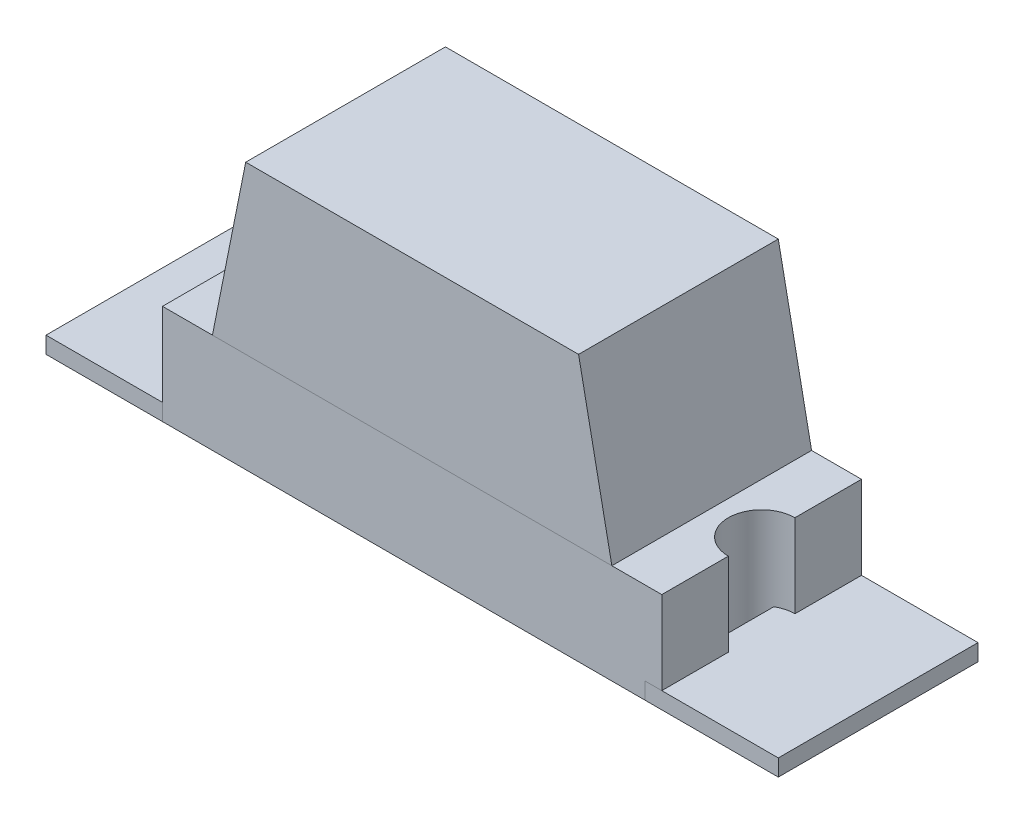
ISO-10303-21;
HEADER;
FILE_DESCRIPTION(('STEP AP214'),'2;1');
FILE_NAME('part.step','',(''),(''),'','','');
FILE_SCHEMA(('AUTOMOTIVE_DESIGN { 1 0 10303 214 1 1 1 1 }'));
ENDSEC;
DATA;
#1=APPLICATION_CONTEXT('core data for automotive mechanical design processes');
#2=APPLICATION_PROTOCOL_DEFINITION('international standard','automotive_design',2000,#1);
#3=PRODUCT_CONTEXT('',#1,'mechanical');
#4=PRODUCT('Part','Part','',(#3));
#5=PRODUCT_RELATED_PRODUCT_CATEGORY('part','',(#4));
#6=PRODUCT_DEFINITION_FORMATION('','',#4);
#7=PRODUCT_DEFINITION_CONTEXT('part definition',#1,'design');
#8=PRODUCT_DEFINITION('design','',#6,#7);
#9=PRODUCT_DEFINITION_SHAPE('','',#8);
#10=(LENGTH_UNIT() NAMED_UNIT(*) SI_UNIT(.MILLI.,.METRE.));
#11=(NAMED_UNIT(*) PLANE_ANGLE_UNIT() SI_UNIT($,.RADIAN.));
#12=(NAMED_UNIT(*) SI_UNIT($,.STERADIAN.) SOLID_ANGLE_UNIT());
#13=UNCERTAINTY_MEASURE_WITH_UNIT(LENGTH_MEASURE(1.E-05),#10,'distance_accuracy_value','');
#14=(GEOMETRIC_REPRESENTATION_CONTEXT(3) GLOBAL_UNCERTAINTY_ASSIGNED_CONTEXT((#13)) GLOBAL_UNIT_ASSIGNED_CONTEXT((#10,
#11,#12)) REPRESENTATION_CONTEXT('',''));
#15=CARTESIAN_POINT('',(0.,0.,0.));
#16=DIRECTION('',(0.,0.,1.));
#17=DIRECTION('',(1.,0.,0.));
#18=AXIS2_PLACEMENT_3D('',#15,#16,#17);
#19=CARTESIAN_POINT('',(-0.5,0.8,0.3));
#20=DIRECTION('',(0.98058067569092,-0.196116135138184,0.));
#21=DIRECTION('',(0.196116135138184,0.98058067569092,0.));
#22=AXIS2_PLACEMENT_3D('',#19,#20,#21);
#23=PLANE('',#22);
#24=DIRECTION('',(-0.196116135138184,-0.98058067569092,0.));
#25=VECTOR('',#24,1.);
#26=CARTESIAN_POINT('',(-0.5,0.8,-0.3));
#27=LINE('',#26,#25);
#28=CARTESIAN_POINT('',(-0.5,0.8,-0.3));
#29=VERTEX_POINT('',#28);
#30=CARTESIAN_POINT('',(-0.6,0.3,-0.3));
#31=VERTEX_POINT('',#30);
#32=EDGE_CURVE('E120',#29,#31,#27,.T.);
#33=ORIENTED_EDGE('',*,*,#32,.T.);
#34=DIRECTION('',(0.,0.,-1.));
#35=VECTOR('',#34,1.);
#36=CARTESIAN_POINT('',(-0.6,0.3,0.3));
#37=LINE('',#36,#35);
#38=CARTESIAN_POINT('',(-0.6,0.3,0.3));
#39=VERTEX_POINT('',#38);
#40=EDGE_CURVE('E12',#39,#31,#37,.T.);
#41=ORIENTED_EDGE('',*,*,#40,.F.);
#42=DIRECTION('',(-0.196116135138184,-0.98058067569092,0.));
#43=VECTOR('',#42,1.);
#44=CARTESIAN_POINT('',(-0.5,0.8,0.3));
#45=LINE('',#44,#43);
#46=CARTESIAN_POINT('',(-0.5,0.8,0.3));
#47=VERTEX_POINT('',#46);
#48=EDGE_CURVE('E104',#47,#39,#45,.T.);
#49=ORIENTED_EDGE('',*,*,#48,.F.);
#50=DIRECTION('',(0.,0.,-1.));
#51=VECTOR('',#50,1.);
#52=CARTESIAN_POINT('',(-0.5,0.8,0.3));
#53=LINE('',#52,#51);
#54=EDGE_CURVE('E116',#47,#29,#53,.T.);
#55=ORIENTED_EDGE('',*,*,#54,.T.);
#56=EDGE_LOOP('',(#33,#41,#49,#55));
#57=FACE_BOUND('',#56,.T.);
#58=ADVANCED_FACE('F52',(#57),#23,.F.);
#59=CARTESIAN_POINT('',(-0.6,0.3,0.3));
#60=DIRECTION('',(0.,1.,0.));
#61=DIRECTION('',(-1.,0.,0.));
#62=AXIS2_PLACEMENT_3D('',#59,#60,#61);
#63=PLANE('',#62);
#64=DIRECTION('',(1.,0.,0.));
#65=VECTOR('',#64,1.);
#66=CARTESIAN_POINT('',(-0.6,0.3,-0.3));
#67=LINE('',#66,#65);
#68=CARTESIAN_POINT('',(0.6,0.3,-0.3));
#69=VERTEX_POINT('',#68);
#70=EDGE_CURVE('E109',#31,#69,#67,.T.);
#71=ORIENTED_EDGE('',*,*,#70,.T.);
#72=DIRECTION('',(0.,0.,-1.));
#73=VECTOR('',#72,1.);
#74=CARTESIAN_POINT('',(0.6,0.3,0.3));
#75=LINE('',#74,#73);
#76=CARTESIAN_POINT('',(0.6,0.3,0.3));
#77=VERTEX_POINT('',#76);
#78=EDGE_CURVE('E61',#77,#69,#75,.T.);
#79=ORIENTED_EDGE('',*,*,#78,.F.);
#80=DIRECTION('',(1.,0.,0.));
#81=VECTOR('',#80,1.);
#82=CARTESIAN_POINT('',(-0.6,0.3,0.3));
#83=LINE('',#82,#81);
#84=EDGE_CURVE('E99',#39,#77,#83,.T.);
#85=ORIENTED_EDGE('',*,*,#84,.F.);
#86=ORIENTED_EDGE('',*,*,#40,.T.);
#87=EDGE_LOOP('',(#71,#79,#85,#86));
#88=FACE_BOUND('',#87,.T.);
#89=ADVANCED_FACE('F108',(#88),#63,.F.);
#90=CARTESIAN_POINT('',(0.6,0.3,0.3));
#91=DIRECTION('',(-0.98058067569092,-0.196116135138184,0.));
#92=DIRECTION('',(0.196116135138184,-0.98058067569092,0.));
#93=AXIS2_PLACEMENT_3D('',#90,#91,#92);
#94=PLANE('',#93);
#95=DIRECTION('',(-0.196116135138184,0.98058067569092,0.));
#96=VECTOR('',#95,1.);
#97=CARTESIAN_POINT('',(0.6,0.3,-0.3));
#98=LINE('',#97,#96);
#99=CARTESIAN_POINT('',(0.5,0.8,-0.3));
#100=VERTEX_POINT('',#99);
#101=EDGE_CURVE('E86',#69,#100,#98,.T.);
#102=ORIENTED_EDGE('',*,*,#101,.T.);
#103=DIRECTION('',(0.,0.,-1.));
#104=VECTOR('',#103,1.);
#105=CARTESIAN_POINT('',(0.5,0.8,0.3));
#106=LINE('',#105,#104);
#107=CARTESIAN_POINT('',(0.5,0.8,0.3));
#108=VERTEX_POINT('',#107);
#109=EDGE_CURVE('E111',#108,#100,#106,.T.);
#110=ORIENTED_EDGE('',*,*,#109,.F.);
#111=DIRECTION('',(-0.196116135138184,0.98058067569092,0.));
#112=VECTOR('',#111,1.);
#113=CARTESIAN_POINT('',(0.6,0.3,0.3));
#114=LINE('',#113,#112);
#115=EDGE_CURVE('E102',#77,#108,#114,.T.);
#116=ORIENTED_EDGE('',*,*,#115,.F.);
#117=ORIENTED_EDGE('',*,*,#78,.T.);
#118=EDGE_LOOP('',(#102,#110,#116,#117));
#119=FACE_BOUND('',#118,.T.);
#120=ADVANCED_FACE('F112',(#119),#94,.F.);
#121=CARTESIAN_POINT('',(0.5,0.8,0.3));
#122=DIRECTION('',(0.,-1.,0.));
#123=DIRECTION('',(1.,0.,0.));
#124=AXIS2_PLACEMENT_3D('',#121,#122,#123);
#125=PLANE('',#124);
#126=DIRECTION('',(-1.,0.,0.));
#127=VECTOR('',#126,1.);
#128=CARTESIAN_POINT('',(0.5,0.8,-0.3));
#129=LINE('',#128,#127);
#130=EDGE_CURVE('E92',#100,#29,#129,.T.);
#131=ORIENTED_EDGE('',*,*,#130,.T.);
#132=ORIENTED_EDGE('',*,*,#54,.F.);
#133=DIRECTION('',(-1.,0.,0.));
#134=VECTOR('',#133,1.);
#135=CARTESIAN_POINT('',(0.5,0.8,0.3));
#136=LINE('',#135,#134);
#137=EDGE_CURVE('E69',#108,#47,#136,.T.);
#138=ORIENTED_EDGE('',*,*,#137,.F.);
#139=ORIENTED_EDGE('',*,*,#109,.T.);
#140=EDGE_LOOP('',(#131,#132,#138,#139));
#141=FACE_BOUND('',#140,.T.);
#142=ADVANCED_FACE('F133',(#141),#125,.F.);
#143=CARTESIAN_POINT('',(0.,0.,0.3));
#144=DIRECTION('',(0.,0.,1.));
#145=DIRECTION('',(1.,0.,0.));
#146=AXIS2_PLACEMENT_3D('',#143,#144,#145);
#147=PLANE('',#146);
#148=ORIENTED_EDGE('',*,*,#48,.T.);
#149=ORIENTED_EDGE('',*,*,#84,.T.);
#150=ORIENTED_EDGE('',*,*,#115,.T.);
#151=ORIENTED_EDGE('',*,*,#137,.T.);
#152=EDGE_LOOP('',(#148,#149,#150,#151));
#153=FACE_BOUND('',#152,.T.);
#154=ADVANCED_FACE('F100',(#153),#147,.T.);
#155=CARTESIAN_POINT('',(0.,0.,-0.3));
#156=DIRECTION('',(0.,0.,1.));
#157=DIRECTION('',(1.,0.,0.));
#158=AXIS2_PLACEMENT_3D('',#155,#156,#157);
#159=PLANE('',#158);
#160=ORIENTED_EDGE('',*,*,#32,.F.);
#161=ORIENTED_EDGE('',*,*,#130,.F.);
#162=ORIENTED_EDGE('',*,*,#101,.F.);
#163=ORIENTED_EDGE('',*,*,#70,.F.);
#164=EDGE_LOOP('',(#160,#161,#162,#163));
#165=FACE_BOUND('',#164,.T.);
#166=ADVANCED_FACE('F136',(#165),#159,.F.);
#167=CLOSED_SHELL('',(#58,#89,#120,#142,#154,#166));
#168=MANIFOLD_SOLID_BREP('B2',#167);
#169=CARTESIAN_POINT('',(1.1,0.05,-0.3));
#170=DIRECTION('',(0.,0.,1.));
#171=DIRECTION('',(1.,0.,0.));
#172=AXIS2_PLACEMENT_3D('',#169,#170,#171);
#173=PLANE('',#172);
#174=DIRECTION('',(-1.,0.,0.));
#175=VECTOR('',#174,1.);
#176=CARTESIAN_POINT('',(1.1,0.,-0.3));
#177=LINE('',#176,#175);
#178=CARTESIAN_POINT('',(1.1,0.,-0.3));
#179=VERTEX_POINT('',#178);
#180=CARTESIAN_POINT('',(0.7,0.,-0.3));
#181=VERTEX_POINT('',#180);
#182=EDGE_CURVE('E261',#179,#181,#177,.T.);
#183=ORIENTED_EDGE('',*,*,#182,.T.);
#184=DIRECTION('',(0.,-1.,0.));
#185=VECTOR('',#184,1.);
#186=CARTESIAN_POINT('',(0.7,0.05,-0.3));
#187=LINE('',#186,#185);
#188=CARTESIAN_POINT('',(0.7,0.05,-0.3));
#189=VERTEX_POINT('',#188);
#190=EDGE_CURVE('E50',#189,#181,#187,.T.);
#191=ORIENTED_EDGE('',*,*,#190,.F.);
#192=DIRECTION('',(-1.,0.,0.));
#193=VECTOR('',#192,1.);
#194=CARTESIAN_POINT('',(1.1,0.05,-0.3));
#195=LINE('',#194,#193);
#196=CARTESIAN_POINT('',(1.1,0.05,-0.3));
#197=VERTEX_POINT('',#196);
#198=EDGE_CURVE('E249',#197,#189,#195,.T.);
#199=ORIENTED_EDGE('',*,*,#198,.F.);
#200=DIRECTION('',(0.,-1.,0.));
#201=VECTOR('',#200,1.);
#202=CARTESIAN_POINT('',(1.1,0.05,-0.3));
#203=LINE('',#202,#201);
#204=EDGE_CURVE('E257',#197,#179,#203,.T.);
#205=ORIENTED_EDGE('',*,*,#204,.T.);
#206=EDGE_LOOP('',(#183,#191,#199,#205));
#207=FACE_BOUND('',#206,.T.);
#208=ADVANCED_FACE('F198',(#207),#173,.F.);
#209=CARTESIAN_POINT('',(0.7,0.05,-0.3));
#210=DIRECTION('',(1.,0.,0.));
#211=DIRECTION('',(0.,0.,-1.));
#212=AXIS2_PLACEMENT_3D('',#209,#210,#211);
#213=PLANE('',#212);
#214=DIRECTION('',(0.,0.,1.));
#215=VECTOR('',#214,1.);
#216=CARTESIAN_POINT('',(0.7,0.,-0.3));
#217=LINE('',#216,#215);
#218=CARTESIAN_POINT('',(0.7,0.,0.3));
#219=VERTEX_POINT('',#218);
#220=EDGE_CURVE('E253',#181,#219,#217,.T.);
#221=ORIENTED_EDGE('',*,*,#220,.T.);
#222=DIRECTION('',(0.,-1.,0.));
#223=VECTOR('',#222,1.);
#224=CARTESIAN_POINT('',(0.7,0.05,0.3));
#225=LINE('',#224,#223);
#226=CARTESIAN_POINT('',(0.7,0.05,0.3));
#227=VERTEX_POINT('',#226);
#228=EDGE_CURVE('E206',#227,#219,#225,.T.);
#229=ORIENTED_EDGE('',*,*,#228,.F.);
#230=DIRECTION('',(0.,0.,1.));
#231=VECTOR('',#230,1.);
#232=CARTESIAN_POINT('',(0.7,0.05,-0.3));
#233=LINE('',#232,#231);
#234=EDGE_CURVE('E244',#189,#227,#233,.T.);
#235=ORIENTED_EDGE('',*,*,#234,.F.);
#236=ORIENTED_EDGE('',*,*,#190,.T.);
#237=EDGE_LOOP('',(#221,#229,#235,#236));
#238=FACE_BOUND('',#237,.T.);
#239=ADVANCED_FACE('F252',(#238),#213,.F.);
#240=CARTESIAN_POINT('',(1.1,0.05,0.3));
#241=DIRECTION('',(0.,0.,-1.));
#242=DIRECTION('',(-1.,0.,0.));
#243=AXIS2_PLACEMENT_3D('',#240,#241,#242);
#244=PLANE('',#243);
#245=DIRECTION('',(1.,0.,0.));
#246=VECTOR('',#245,1.);
#247=CARTESIAN_POINT('',(1.1,0.,0.3));
#248=LINE('',#247,#246);
#249=CARTESIAN_POINT('',(1.1,0.,0.3));
#250=VERTEX_POINT('',#249);
#251=EDGE_CURVE('E231',#219,#250,#248,.T.);
#252=ORIENTED_EDGE('',*,*,#251,.T.);
#253=DIRECTION('',(0.,-1.,0.));
#254=VECTOR('',#253,1.);
#255=CARTESIAN_POINT('',(1.1,0.05,0.3));
#256=LINE('',#255,#254);
#257=CARTESIAN_POINT('',(1.1,0.05,0.3));
#258=VERTEX_POINT('',#257);
#259=EDGE_CURVE('E254',#258,#250,#256,.T.);
#260=ORIENTED_EDGE('',*,*,#259,.F.);
#261=DIRECTION('',(1.,0.,0.));
#262=VECTOR('',#261,1.);
#263=CARTESIAN_POINT('',(1.1,0.05,0.3));
#264=LINE('',#263,#262);
#265=EDGE_CURVE('E247',#227,#258,#264,.T.);
#266=ORIENTED_EDGE('',*,*,#265,.F.);
#267=ORIENTED_EDGE('',*,*,#228,.T.);
#268=EDGE_LOOP('',(#252,#260,#266,#267));
#269=FACE_BOUND('',#268,.T.);
#270=ADVANCED_FACE('F255',(#269),#244,.F.);
#271=CARTESIAN_POINT('',(1.1,0.05,-0.3));
#272=DIRECTION('',(-1.,0.,0.));
#273=DIRECTION('',(0.,0.,1.));
#274=AXIS2_PLACEMENT_3D('',#271,#272,#273);
#275=PLANE('',#274);
#276=DIRECTION('',(0.,0.,-1.));
#277=VECTOR('',#276,1.);
#278=CARTESIAN_POINT('',(1.1,0.,-0.3));
#279=LINE('',#278,#277);
#280=EDGE_CURVE('E237',#250,#179,#279,.T.);
#281=ORIENTED_EDGE('',*,*,#280,.T.);
#282=ORIENTED_EDGE('',*,*,#204,.F.);
#283=DIRECTION('',(0.,0.,-1.));
#284=VECTOR('',#283,1.);
#285=CARTESIAN_POINT('',(1.1,0.05,-0.3));
#286=LINE('',#285,#284);
#287=EDGE_CURVE('E214',#258,#197,#286,.T.);
#288=ORIENTED_EDGE('',*,*,#287,.F.);
#289=ORIENTED_EDGE('',*,*,#259,.T.);
#290=EDGE_LOOP('',(#281,#282,#288,#289));
#291=FACE_BOUND('',#290,.T.);
#292=ADVANCED_FACE('F268',(#291),#275,.F.);
#293=CARTESIAN_POINT('',(0.,0.05,0.));
#294=DIRECTION('',(0.,1.,0.));
#295=DIRECTION('',(0.,0.,1.));
#296=AXIS2_PLACEMENT_3D('',#293,#294,#295);
#297=PLANE('',#296);
#298=ORIENTED_EDGE('',*,*,#198,.T.);
#299=ORIENTED_EDGE('',*,*,#234,.T.);
#300=ORIENTED_EDGE('',*,*,#265,.T.);
#301=ORIENTED_EDGE('',*,*,#287,.T.);
#302=EDGE_LOOP('',(#298,#299,#300,#301));
#303=FACE_BOUND('',#302,.T.);
#304=ADVANCED_FACE('F245',(#303),#297,.T.);
#305=CARTESIAN_POINT('',(0.,0.,0.));
#306=DIRECTION('',(0.,1.,0.));
#307=DIRECTION('',(0.,0.,1.));
#308=AXIS2_PLACEMENT_3D('',#305,#306,#307);
#309=PLANE('',#308);
#310=ORIENTED_EDGE('',*,*,#182,.F.);
#311=ORIENTED_EDGE('',*,*,#280,.F.);
#312=ORIENTED_EDGE('',*,*,#251,.F.);
#313=ORIENTED_EDGE('',*,*,#220,.F.);
#314=EDGE_LOOP('',(#310,#311,#312,#313));
#315=FACE_BOUND('',#314,.T.);
#316=ADVANCED_FACE('F271',(#315),#309,.F.);
#317=CLOSED_SHELL('',(#208,#239,#270,#292,#304,#316));
#318=MANIFOLD_SOLID_BREP('B6',#317);
#319=CARTESIAN_POINT('',(-1.1,0.05,-0.3));
#320=DIRECTION('',(1.,0.,0.));
#321=DIRECTION('',(0.,0.,-1.));
#322=AXIS2_PLACEMENT_3D('',#319,#320,#321);
#323=PLANE('',#322);
#324=DIRECTION('',(0.,0.,1.));
#325=VECTOR('',#324,1.);
#326=CARTESIAN_POINT('',(-1.1,0.,-0.3));
#327=LINE('',#326,#325);
#328=CARTESIAN_POINT('',(-1.1,0.,-0.3));
#329=VERTEX_POINT('',#328);
#330=CARTESIAN_POINT('',(-1.1,0.,0.3));
#331=VERTEX_POINT('',#330);
#332=EDGE_CURVE('E393',#329,#331,#327,.T.);
#333=ORIENTED_EDGE('',*,*,#332,.T.);
#334=DIRECTION('',(0.,-1.,0.));
#335=VECTOR('',#334,1.);
#336=CARTESIAN_POINT('',(-1.1,0.05,0.3));
#337=LINE('',#336,#335);
#338=CARTESIAN_POINT('',(-1.1,0.05,0.3));
#339=VERTEX_POINT('',#338);
#340=EDGE_CURVE('E196',#339,#331,#337,.T.);
#341=ORIENTED_EDGE('',*,*,#340,.F.);
#342=DIRECTION('',(0.,0.,1.));
#343=VECTOR('',#342,1.);
#344=CARTESIAN_POINT('',(-1.1,0.05,-0.3));
#345=LINE('',#344,#343);
#346=CARTESIAN_POINT('',(-1.1,0.05,-0.3));
#347=VERTEX_POINT('',#346);
#348=EDGE_CURVE('E381',#347,#339,#345,.T.);
#349=ORIENTED_EDGE('',*,*,#348,.F.);
#350=DIRECTION('',(0.,-1.,0.));
#351=VECTOR('',#350,1.);
#352=CARTESIAN_POINT('',(-1.1,0.05,-0.3));
#353=LINE('',#352,#351);
#354=EDGE_CURVE('E389',#347,#329,#353,.T.);
#355=ORIENTED_EDGE('',*,*,#354,.T.);
#356=EDGE_LOOP('',(#333,#341,#349,#355));
#357=FACE_BOUND('',#356,.T.);
#358=ADVANCED_FACE('F330',(#357),#323,.F.);
#359=CARTESIAN_POINT('',(-1.1,0.05,0.3));
#360=DIRECTION('',(0.,0.,-1.));
#361=DIRECTION('',(-1.,0.,0.));
#362=AXIS2_PLACEMENT_3D('',#359,#360,#361);
#363=PLANE('',#362);
#364=DIRECTION('',(1.,0.,0.));
#365=VECTOR('',#364,1.);
#366=CARTESIAN_POINT('',(-1.1,0.,0.3));
#367=LINE('',#366,#365);
#368=CARTESIAN_POINT('',(-0.7,0.,0.3));
#369=VERTEX_POINT('',#368);
#370=EDGE_CURVE('E385',#331,#369,#367,.T.);
#371=ORIENTED_EDGE('',*,*,#370,.T.);
#372=DIRECTION('',(0.,-1.,0.));
#373=VECTOR('',#372,1.);
#374=CARTESIAN_POINT('',(-0.7,0.05,0.3));
#375=LINE('',#374,#373);
#376=CARTESIAN_POINT('',(-0.7,0.05,0.3));
#377=VERTEX_POINT('',#376);
#378=EDGE_CURVE('E338',#377,#369,#375,.T.);
#379=ORIENTED_EDGE('',*,*,#378,.F.);
#380=DIRECTION('',(1.,0.,0.));
#381=VECTOR('',#380,1.);
#382=CARTESIAN_POINT('',(-1.1,0.05,0.3));
#383=LINE('',#382,#381);
#384=EDGE_CURVE('E376',#339,#377,#383,.T.);
#385=ORIENTED_EDGE('',*,*,#384,.F.);
#386=ORIENTED_EDGE('',*,*,#340,.T.);
#387=EDGE_LOOP('',(#371,#379,#385,#386));
#388=FACE_BOUND('',#387,.T.);
#389=ADVANCED_FACE('F384',(#388),#363,.F.);
#390=CARTESIAN_POINT('',(-0.7,0.05,-0.3));
#391=DIRECTION('',(-1.,0.,0.));
#392=DIRECTION('',(0.,0.,1.));
#393=AXIS2_PLACEMENT_3D('',#390,#391,#392);
#394=PLANE('',#393);
#395=DIRECTION('',(0.,0.,-1.));
#396=VECTOR('',#395,1.);
#397=CARTESIAN_POINT('',(-0.7,0.,-0.3));
#398=LINE('',#397,#396);
#399=CARTESIAN_POINT('',(-0.7,0.,-0.3));
#400=VERTEX_POINT('',#399);
#401=EDGE_CURVE('E363',#369,#400,#398,.T.);
#402=ORIENTED_EDGE('',*,*,#401,.T.);
#403=DIRECTION('',(0.,-1.,0.));
#404=VECTOR('',#403,1.);
#405=CARTESIAN_POINT('',(-0.7,0.05,-0.3));
#406=LINE('',#405,#404);
#407=CARTESIAN_POINT('',(-0.7,0.05,-0.3));
#408=VERTEX_POINT('',#407);
#409=EDGE_CURVE('E386',#408,#400,#406,.T.);
#410=ORIENTED_EDGE('',*,*,#409,.F.);
#411=DIRECTION('',(0.,0.,-1.));
#412=VECTOR('',#411,1.);
#413=CARTESIAN_POINT('',(-0.7,0.05,-0.3));
#414=LINE('',#413,#412);
#415=EDGE_CURVE('E379',#377,#408,#414,.T.);
#416=ORIENTED_EDGE('',*,*,#415,.F.);
#417=ORIENTED_EDGE('',*,*,#378,.T.);
#418=EDGE_LOOP('',(#402,#410,#416,#417));
#419=FACE_BOUND('',#418,.T.);
#420=ADVANCED_FACE('F387',(#419),#394,.F.);
#421=CARTESIAN_POINT('',(-1.1,0.05,-0.3));
#422=DIRECTION('',(0.,0.,1.));
#423=DIRECTION('',(1.,0.,0.));
#424=AXIS2_PLACEMENT_3D('',#421,#422,#423);
#425=PLANE('',#424);
#426=DIRECTION('',(-1.,0.,0.));
#427=VECTOR('',#426,1.);
#428=CARTESIAN_POINT('',(-1.1,0.,-0.3));
#429=LINE('',#428,#427);
#430=EDGE_CURVE('E369',#400,#329,#429,.T.);
#431=ORIENTED_EDGE('',*,*,#430,.T.);
#432=ORIENTED_EDGE('',*,*,#354,.F.);
#433=DIRECTION('',(-1.,0.,0.));
#434=VECTOR('',#433,1.);
#435=CARTESIAN_POINT('',(-1.1,0.05,-0.3));
#436=LINE('',#435,#434);
#437=EDGE_CURVE('E346',#408,#347,#436,.T.);
#438=ORIENTED_EDGE('',*,*,#437,.F.);
#439=ORIENTED_EDGE('',*,*,#409,.T.);
#440=EDGE_LOOP('',(#431,#432,#438,#439));
#441=FACE_BOUND('',#440,.T.);
#442=ADVANCED_FACE('F400',(#441),#425,.F.);
#443=CARTESIAN_POINT('',(0.,0.05,0.));
#444=DIRECTION('',(0.,1.,0.));
#445=DIRECTION('',(0.,0.,1.));
#446=AXIS2_PLACEMENT_3D('',#443,#444,#445);
#447=PLANE('',#446);
#448=ORIENTED_EDGE('',*,*,#348,.T.);
#449=ORIENTED_EDGE('',*,*,#384,.T.);
#450=ORIENTED_EDGE('',*,*,#415,.T.);
#451=ORIENTED_EDGE('',*,*,#437,.T.);
#452=EDGE_LOOP('',(#448,#449,#450,#451));
#453=FACE_BOUND('',#452,.T.);
#454=ADVANCED_FACE('F377',(#453),#447,.T.);
#455=CARTESIAN_POINT('',(0.,0.,0.));
#456=DIRECTION('',(0.,1.,0.));
#457=DIRECTION('',(0.,0.,1.));
#458=AXIS2_PLACEMENT_3D('',#455,#456,#457);
#459=PLANE('',#458);
#460=ORIENTED_EDGE('',*,*,#332,.F.);
#461=ORIENTED_EDGE('',*,*,#430,.F.);
#462=ORIENTED_EDGE('',*,*,#401,.F.);
#463=ORIENTED_EDGE('',*,*,#370,.F.);
#464=EDGE_LOOP('',(#460,#461,#462,#463));
#465=FACE_BOUND('',#464,.T.);
#466=ADVANCED_FACE('F403',(#465),#459,.F.);
#467=CLOSED_SHELL('',(#358,#389,#420,#442,#454,#466));
#468=MANIFOLD_SOLID_BREP('B44',#467);
#469=CARTESIAN_POINT('',(0.,0.3,0.));
#470=DIRECTION('',(0.,1.,0.));
#471=DIRECTION('',(0.,0.,1.));
#472=AXIS2_PLACEMENT_3D('',#469,#470,#471);
#473=PLANE('',#472);
#474=CARTESIAN_POINT('',(0.,0.3,0.));
#475=DIRECTION('',(0.,1.,0.));
#476=DIRECTION('',(0.,0.,1.));
#477=AXIS2_PLACEMENT_3D('',#474,#475,#476);
#478=CIRCLE('',#477,0.25);
#479=CARTESIAN_POINT('',(0.,0.3,0.25));
#480=VERTEX_POINT('',#479);
#481=EDGE_CURVE('E329',#480,#480,#478,.T.);
#482=ORIENTED_EDGE('',*,*,#481,.F.);
#483=EDGE_LOOP('',(#482));
#484=FACE_BOUND('',#483,.T.);
#485=ADVANCED_FACE('F463',(#484),#473,.F.);
#486=CARTESIAN_POINT('',(0.,0.809216281577376,0.));
#487=DIRECTION('',(0.,1.,0.));
#488=DIRECTION('',(0.,0.,1.));
#489=AXIS2_PLACEMENT_3D('',#486,#487,#488);
#490=CYLINDRICAL_SURFACE('',#489,0.25);
#491=CARTESIAN_POINT('',(0.,0.5,0.));
#492=DIRECTION('',(0.,1.,0.));
#493=DIRECTION('',(0.,0.,1.));
#494=AXIS2_PLACEMENT_3D('',#491,#492,#493);
#495=CIRCLE('',#494,0.25);
#496=CARTESIAN_POINT('',(0.,0.5,0.25));
#497=VERTEX_POINT('',#496);
#498=EDGE_CURVE('E469',#497,#497,#495,.T.);
#499=ORIENTED_EDGE('',*,*,#498,.F.);
#500=EDGE_LOOP('',(#499));
#501=FACE_BOUND('',#500,.T.);
#502=ORIENTED_EDGE('',*,*,#481,.T.);
#503=EDGE_LOOP('',(#502));
#504=FACE_BOUND('',#503,.T.);
#505=ADVANCED_FACE('F477',(#501,#504),#490,.T.);
#506=CARTESIAN_POINT('',(0.,0.5,0.));
#507=DIRECTION('',(0.,-1.,0.));
#508=DIRECTION('',(0.,0.,-1.));
#509=AXIS2_PLACEMENT_3D('',#506,#507,#508);
#510=PLANE('',#509);
#511=ORIENTED_EDGE('',*,*,#498,.T.);
#512=EDGE_LOOP('',(#511));
#513=FACE_BOUND('',#512,.T.);
#514=ADVANCED_FACE('F475',(#513),#510,.F.);
#515=CLOSED_SHELL('',(#485,#505,#514));
#516=MANIFOLD_SOLID_BREP('B190',#515);
#517=CARTESIAN_POINT('',(-0.75,0.3,-0.3));
#518=DIRECTION('',(1.,0.,0.));
#519=DIRECTION('',(0.,0.,-1.));
#520=AXIS2_PLACEMENT_3D('',#517,#518,#519);
#521=PLANE('',#520);
#522=DIRECTION('',(0.,0.,1.));
#523=VECTOR('',#522,1.);
#524=CARTESIAN_POINT('',(-0.75,0.,-0.3));
#525=LINE('',#524,#523);
#526=CARTESIAN_POINT('',(-0.75,0.,-0.3));
#527=VERTEX_POINT('',#526);
#528=CARTESIAN_POINT('',(-0.75,0.,-0.1));
#529=VERTEX_POINT('',#528);
#530=EDGE_CURVE('E600',#527,#529,#525,.T.);
#531=ORIENTED_EDGE('',*,*,#530,.T.);
#532=DIRECTION('',(0.,-1.,0.));
#533=VECTOR('',#532,1.);
#534=CARTESIAN_POINT('',(-0.75,0.3,-0.1));
#535=LINE('',#534,#533);
#536=CARTESIAN_POINT('',(-0.75,0.3,-0.1));
#537=VERTEX_POINT('',#536);
#538=EDGE_CURVE('E461',#537,#529,#535,.T.);
#539=ORIENTED_EDGE('',*,*,#538,.F.);
#540=DIRECTION('',(0.,0.,1.));
#541=VECTOR('',#540,1.);
#542=CARTESIAN_POINT('',(-0.75,0.3,-0.3));
#543=LINE('',#542,#541);
#544=CARTESIAN_POINT('',(-0.75,0.3,-0.3));
#545=VERTEX_POINT('',#544);
#546=EDGE_CURVE('E614',#545,#537,#543,.T.);
#547=ORIENTED_EDGE('',*,*,#546,.F.);
#548=DIRECTION('',(0.,-1.,0.));
#549=VECTOR('',#548,1.);
#550=CARTESIAN_POINT('',(-0.75,0.3,-0.3));
#551=LINE('',#550,#549);
#552=EDGE_CURVE('E596',#545,#527,#551,.T.);
#553=ORIENTED_EDGE('',*,*,#552,.T.);
#554=EDGE_LOOP('',(#531,#539,#547,#553));
#555=FACE_BOUND('',#554,.T.);
#556=ADVANCED_FACE('F504',(#555),#521,.F.);
#557=CARTESIAN_POINT('',(-0.75,0.3,0.));
#558=DIRECTION('',(0.,-1.,0.));
#559=DIRECTION('',(0.,0.,-1.));
#560=AXIS2_PLACEMENT_3D('',#557,#558,#559);
#561=CYLINDRICAL_SURFACE('',#560,0.1);
#562=CARTESIAN_POINT('',(-0.75,0.,0.));
#563=DIRECTION('',(0.,-1.,0.));
#564=DIRECTION('',(0.,0.,1.));
#565=AXIS2_PLACEMENT_3D('',#562,#563,#564);
#566=CIRCLE('',#565,0.1);
#567=CARTESIAN_POINT('',(-0.75,0.,0.1));
#568=VERTEX_POINT('',#567);
#569=EDGE_CURVE('E603',#529,#568,#566,.T.);
#570=ORIENTED_EDGE('',*,*,#569,.T.);
#571=DIRECTION('',(0.,-1.,0.));
#572=VECTOR('',#571,1.);
#573=CARTESIAN_POINT('',(-0.75,0.3,0.1));
#574=LINE('',#573,#572);
#575=CARTESIAN_POINT('',(-0.75,0.3,0.1));
#576=VERTEX_POINT('',#575);
#577=EDGE_CURVE('E512',#576,#568,#574,.T.);
#578=ORIENTED_EDGE('',*,*,#577,.F.);
#579=CARTESIAN_POINT('',(-0.75,0.3,0.));
#580=DIRECTION('',(0.,-1.,0.));
#581=DIRECTION('',(0.,0.,1.));
#582=AXIS2_PLACEMENT_3D('',#579,#580,#581);
#583=CIRCLE('',#582,0.1);
#584=EDGE_CURVE('E563',#537,#576,#583,.T.);
#585=ORIENTED_EDGE('',*,*,#584,.F.);
#586=ORIENTED_EDGE('',*,*,#538,.T.);
#587=EDGE_LOOP('',(#570,#578,#585,#586));
#588=FACE_BOUND('',#587,.T.);
#589=ADVANCED_FACE('F649',(#588),#561,.F.);
#590=CARTESIAN_POINT('',(-0.75,0.3,0.1));
#591=DIRECTION('',(1.,0.,0.));
#592=DIRECTION('',(0.,0.,-1.));
#593=AXIS2_PLACEMENT_3D('',#590,#591,#592);
#594=PLANE('',#593);
#595=DIRECTION('',(0.,0.,1.));
#596=VECTOR('',#595,1.);
#597=CARTESIAN_POINT('',(-0.75,0.,0.1));
#598=LINE('',#597,#596);
#599=CARTESIAN_POINT('',(-0.75,0.,0.3));
#600=VERTEX_POINT('',#599);
#601=EDGE_CURVE('E605',#568,#600,#598,.T.);
#602=ORIENTED_EDGE('',*,*,#601,.T.);
#603=DIRECTION('',(0.,-1.,0.));
#604=VECTOR('',#603,1.);
#605=CARTESIAN_POINT('',(-0.75,0.3,0.3));
#606=LINE('',#605,#604);
#607=CARTESIAN_POINT('',(-0.75,0.3,0.3));
#608=VERTEX_POINT('',#607);
#609=EDGE_CURVE('E621',#608,#600,#606,.T.);
#610=ORIENTED_EDGE('',*,*,#609,.F.);
#611=DIRECTION('',(0.,0.,1.));
#612=VECTOR('',#611,1.);
#613=CARTESIAN_POINT('',(-0.75,0.3,0.1));
#614=LINE('',#613,#612);
#615=EDGE_CURVE('E629',#576,#608,#614,.T.);
#616=ORIENTED_EDGE('',*,*,#615,.F.);
#617=ORIENTED_EDGE('',*,*,#577,.T.);
#618=EDGE_LOOP('',(#602,#610,#616,#617));
#619=FACE_BOUND('',#618,.T.);
#620=ADVANCED_FACE('F627',(#619),#594,.F.);
#621=CARTESIAN_POINT('',(-0.75,0.3,0.3));
#622=DIRECTION('',(0.,0.,-1.));
#623=DIRECTION('',(-1.,0.,0.));
#624=AXIS2_PLACEMENT_3D('',#621,#622,#623);
#625=PLANE('',#624);
#626=DIRECTION('',(1.,0.,0.));
#627=VECTOR('',#626,1.);
#628=CARTESIAN_POINT('',(-0.75,0.,0.3));
#629=LINE('',#628,#627);
#630=CARTESIAN_POINT('',(0.75,0.,0.3));
#631=VERTEX_POINT('',#630);
#632=EDGE_CURVE('E607',#600,#631,#629,.T.);
#633=ORIENTED_EDGE('',*,*,#632,.T.);
#634=DIRECTION('',(0.,-1.,0.));
#635=VECTOR('',#634,1.);
#636=CARTESIAN_POINT('',(0.75,0.3,0.3));
#637=LINE('',#636,#635);
#638=CARTESIAN_POINT('',(0.75,0.3,0.3));
#639=VERTEX_POINT('',#638);
#640=EDGE_CURVE('E618',#639,#631,#637,.T.);
#641=ORIENTED_EDGE('',*,*,#640,.F.);
#642=DIRECTION('',(1.,0.,0.));
#643=VECTOR('',#642,1.);
#644=CARTESIAN_POINT('',(-0.75,0.3,0.3));
#645=LINE('',#644,#643);
#646=EDGE_CURVE('E641',#608,#639,#645,.T.);
#647=ORIENTED_EDGE('',*,*,#646,.F.);
#648=ORIENTED_EDGE('',*,*,#609,.T.);
#649=EDGE_LOOP('',(#633,#641,#647,#648));
#650=FACE_BOUND('',#649,.T.);
#651=ADVANCED_FACE('F637',(#650),#625,.F.);
#652=CARTESIAN_POINT('',(0.75,0.3,0.1));
#653=DIRECTION('',(-1.,0.,0.));
#654=DIRECTION('',(0.,0.,1.));
#655=AXIS2_PLACEMENT_3D('',#652,#653,#654);
#656=PLANE('',#655);
#657=DIRECTION('',(0.,0.,-1.));
#658=VECTOR('',#657,1.);
#659=CARTESIAN_POINT('',(0.75,0.,0.1));
#660=LINE('',#659,#658);
#661=CARTESIAN_POINT('',(0.75,0.,0.1));
#662=VERTEX_POINT('',#661);
#663=EDGE_CURVE('E609',#631,#662,#660,.T.);
#664=ORIENTED_EDGE('',*,*,#663,.T.);
#665=DIRECTION('',(0.,-1.,0.));
#666=VECTOR('',#665,1.);
#667=CARTESIAN_POINT('',(0.75,0.3,0.1));
#668=LINE('',#667,#666);
#669=CARTESIAN_POINT('',(0.75,0.3,0.1));
#670=VERTEX_POINT('',#669);
#671=EDGE_CURVE('E591',#670,#662,#668,.T.);
#672=ORIENTED_EDGE('',*,*,#671,.F.);
#673=DIRECTION('',(0.,0.,-1.));
#674=VECTOR('',#673,1.);
#675=CARTESIAN_POINT('',(0.75,0.3,0.1));
#676=LINE('',#675,#674);
#677=EDGE_CURVE('E582',#639,#670,#676,.T.);
#678=ORIENTED_EDGE('',*,*,#677,.F.);
#679=ORIENTED_EDGE('',*,*,#640,.T.);
#680=EDGE_LOOP('',(#664,#672,#678,#679));
#681=FACE_BOUND('',#680,.T.);
#682=ADVANCED_FACE('F640',(#681),#656,.F.);
#683=CARTESIAN_POINT('',(0.75,0.3,0.));
#684=DIRECTION('',(0.,-1.,0.));
#685=DIRECTION('',(0.,0.,-1.));
#686=AXIS2_PLACEMENT_3D('',#683,#684,#685);
#687=CYLINDRICAL_SURFACE('',#686,0.1);
#688=CARTESIAN_POINT('',(0.75,0.,0.));
#689=DIRECTION('',(0.,-1.,0.));
#690=DIRECTION('',(0.,0.,1.));
#691=AXIS2_PLACEMENT_3D('',#688,#689,#690);
#692=CIRCLE('',#691,0.1);
#693=CARTESIAN_POINT('',(0.75,0.,-0.1));
#694=VERTEX_POINT('',#693);
#695=EDGE_CURVE('E590',#662,#694,#692,.T.);
#696=ORIENTED_EDGE('',*,*,#695,.T.);
#697=DIRECTION('',(0.,-1.,0.));
#698=VECTOR('',#697,1.);
#699=CARTESIAN_POINT('',(0.75,0.3,-0.1));
#700=LINE('',#699,#698);
#701=CARTESIAN_POINT('',(0.75,0.3,-0.1));
#702=VERTEX_POINT('',#701);
#703=EDGE_CURVE('E587',#702,#694,#700,.T.);
#704=ORIENTED_EDGE('',*,*,#703,.F.);
#705=CARTESIAN_POINT('',(0.75,0.3,0.));
#706=DIRECTION('',(0.,-1.,0.));
#707=DIRECTION('',(0.,0.,1.));
#708=AXIS2_PLACEMENT_3D('',#705,#706,#707);
#709=CIRCLE('',#708,0.1);
#710=EDGE_CURVE('E576',#670,#702,#709,.T.);
#711=ORIENTED_EDGE('',*,*,#710,.F.);
#712=ORIENTED_EDGE('',*,*,#671,.T.);
#713=EDGE_LOOP('',(#696,#704,#711,#712));
#714=FACE_BOUND('',#713,.T.);
#715=ADVANCED_FACE('F588',(#714),#687,.F.);
#716=CARTESIAN_POINT('',(0.75,0.3,-0.3));
#717=DIRECTION('',(-1.,0.,0.));
#718=DIRECTION('',(0.,0.,1.));
#719=AXIS2_PLACEMENT_3D('',#716,#717,#718);
#720=PLANE('',#719);
#721=DIRECTION('',(0.,0.,-1.));
#722=VECTOR('',#721,1.);
#723=CARTESIAN_POINT('',(0.75,0.,-0.3));
#724=LINE('',#723,#722);
#725=CARTESIAN_POINT('',(0.75,0.,-0.3));
#726=VERTEX_POINT('',#725);
#727=EDGE_CURVE('E549',#694,#726,#724,.T.);
#728=ORIENTED_EDGE('',*,*,#727,.T.);
#729=DIRECTION('',(0.,-1.,0.));
#730=VECTOR('',#729,1.);
#731=CARTESIAN_POINT('',(0.75,0.3,-0.3));
#732=LINE('',#731,#730);
#733=CARTESIAN_POINT('',(0.75,0.3,-0.3));
#734=VERTEX_POINT('',#733);
#735=EDGE_CURVE('E592',#734,#726,#732,.T.);
#736=ORIENTED_EDGE('',*,*,#735,.F.);
#737=DIRECTION('',(0.,0.,-1.));
#738=VECTOR('',#737,1.);
#739=CARTESIAN_POINT('',(0.75,0.3,-0.3));
#740=LINE('',#739,#738);
#741=EDGE_CURVE('E580',#702,#734,#740,.T.);
#742=ORIENTED_EDGE('',*,*,#741,.F.);
#743=ORIENTED_EDGE('',*,*,#703,.T.);
#744=EDGE_LOOP('',(#728,#736,#742,#743));
#745=FACE_BOUND('',#744,.T.);
#746=ADVANCED_FACE('F594',(#745),#720,.F.);
#747=CARTESIAN_POINT('',(-0.75,0.3,-0.3));
#748=DIRECTION('',(0.,0.,1.));
#749=DIRECTION('',(1.,0.,0.));
#750=AXIS2_PLACEMENT_3D('',#747,#748,#749);
#751=PLANE('',#750);
#752=DIRECTION('',(-1.,0.,0.));
#753=VECTOR('',#752,1.);
#754=CARTESIAN_POINT('',(-0.75,0.,-0.3));
#755=LINE('',#754,#753);
#756=EDGE_CURVE('E555',#726,#527,#755,.T.);
#757=ORIENTED_EDGE('',*,*,#756,.T.);
#758=ORIENTED_EDGE('',*,*,#552,.F.);
#759=DIRECTION('',(-1.,0.,0.));
#760=VECTOR('',#759,1.);
#761=CARTESIAN_POINT('',(-0.75,0.3,-0.3));
#762=LINE('',#761,#760);
#763=EDGE_CURVE('E520',#734,#545,#762,.T.);
#764=ORIENTED_EDGE('',*,*,#763,.F.);
#765=ORIENTED_EDGE('',*,*,#735,.T.);
#766=EDGE_LOOP('',(#757,#758,#764,#765));
#767=FACE_BOUND('',#766,.T.);
#768=ADVANCED_FACE('F665',(#767),#751,.F.);
#769=CARTESIAN_POINT('',(-0.75,0.3,0.));
#770=DIRECTION('',(0.,1.,0.));
#771=DIRECTION('',(0.,0.,1.));
#772=AXIS2_PLACEMENT_3D('',#769,#770,#771);
#773=PLANE('',#772);
#774=ORIENTED_EDGE('',*,*,#546,.T.);
#775=ORIENTED_EDGE('',*,*,#584,.T.);
#776=ORIENTED_EDGE('',*,*,#615,.T.);
#777=ORIENTED_EDGE('',*,*,#646,.T.);
#778=ORIENTED_EDGE('',*,*,#677,.T.);
#779=ORIENTED_EDGE('',*,*,#710,.T.);
#780=ORIENTED_EDGE('',*,*,#741,.T.);
#781=ORIENTED_EDGE('',*,*,#763,.T.);
#782=EDGE_LOOP('',(#774,#775,#776,#777,#778,#779,#780,#781));
#783=FACE_BOUND('',#782,.T.);
#784=ADVANCED_FACE('F578',(#783),#773,.T.);
#785=CARTESIAN_POINT('',(-0.75,0.,0.));
#786=DIRECTION('',(0.,1.,0.));
#787=DIRECTION('',(0.,0.,1.));
#788=AXIS2_PLACEMENT_3D('',#785,#786,#787);
#789=PLANE('',#788);
#790=ORIENTED_EDGE('',*,*,#530,.F.);
#791=ORIENTED_EDGE('',*,*,#756,.F.);
#792=ORIENTED_EDGE('',*,*,#727,.F.);
#793=ORIENTED_EDGE('',*,*,#695,.F.);
#794=ORIENTED_EDGE('',*,*,#663,.F.);
#795=ORIENTED_EDGE('',*,*,#632,.F.);
#796=ORIENTED_EDGE('',*,*,#601,.F.);
#797=ORIENTED_EDGE('',*,*,#569,.F.);
#798=EDGE_LOOP('',(#790,#791,#792,#793,#794,#795,#796,#797));
#799=FACE_BOUND('',#798,.T.);
#800=ADVANCED_FACE('F633',(#799),#789,.F.);
#801=CLOSED_SHELL('',(#556,#589,#620,#651,#682,#715,#746,#768,#784,#800));
#802=MANIFOLD_SOLID_BREP('B324',#801);
#803=ADVANCED_BREP_SHAPE_REPRESENTATION('',(#18,#168,#318,#468,#516,#802),#14);
#804=SHAPE_DEFINITION_REPRESENTATION(#9,#803);
ENDSEC;
END-ISO-10303-21;
